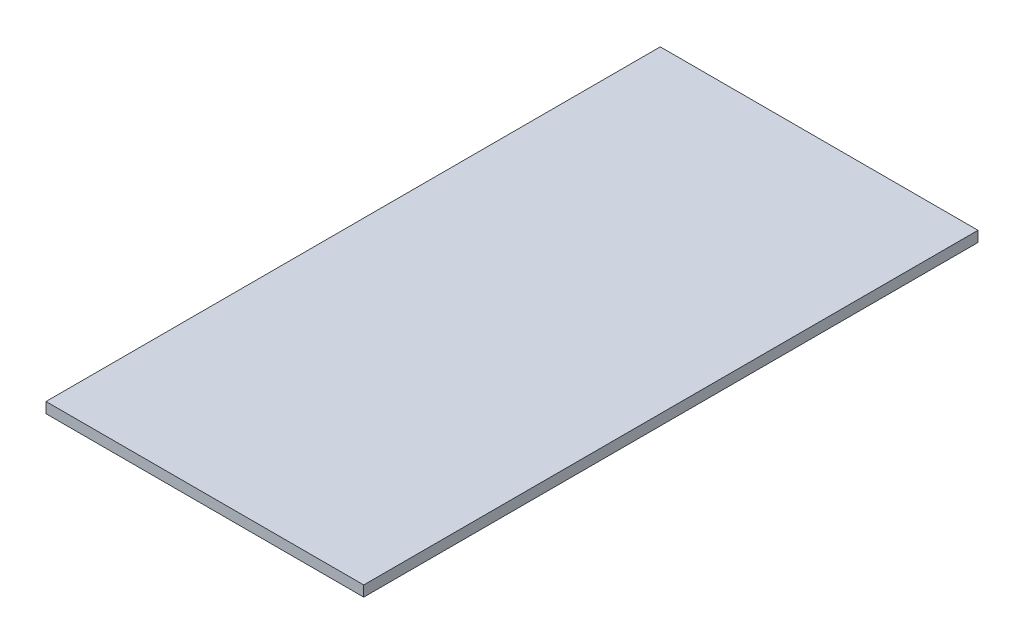
ISO-10303-21;
HEADER;
FILE_DESCRIPTION(('STEP AP214'),'2;1');
FILE_NAME('part.step','',(''),(''),'','','');
FILE_SCHEMA(('AUTOMOTIVE_DESIGN { 1 0 10303 214 1 1 1 1 }'));
ENDSEC;
DATA;
#1=APPLICATION_CONTEXT('core data for automotive mechanical design processes');
#2=APPLICATION_PROTOCOL_DEFINITION('international standard','automotive_design',2000,#1);
#3=PRODUCT_CONTEXT('',#1,'mechanical');
#4=PRODUCT('Part','Part','',(#3));
#5=PRODUCT_RELATED_PRODUCT_CATEGORY('part','',(#4));
#6=PRODUCT_DEFINITION_FORMATION('','',#4);
#7=PRODUCT_DEFINITION_CONTEXT('part definition',#1,'design');
#8=PRODUCT_DEFINITION('design','',#6,#7);
#9=PRODUCT_DEFINITION_SHAPE('','',#8);
#10=(LENGTH_UNIT() NAMED_UNIT(*) SI_UNIT(.MILLI.,.METRE.));
#11=(NAMED_UNIT(*) PLANE_ANGLE_UNIT() SI_UNIT($,.RADIAN.));
#12=(NAMED_UNIT(*) SI_UNIT($,.STERADIAN.) SOLID_ANGLE_UNIT());
#13=UNCERTAINTY_MEASURE_WITH_UNIT(LENGTH_MEASURE(1.E-05),#10,'distance_accuracy_value','');
#14=(GEOMETRIC_REPRESENTATION_CONTEXT(3) GLOBAL_UNCERTAINTY_ASSIGNED_CONTEXT((#13)) GLOBAL_UNIT_ASSIGNED_CONTEXT((#10,
#11,#12)) REPRESENTATION_CONTEXT('',''));
#15=CARTESIAN_POINT('',(0.,0.,0.));
#16=DIRECTION('',(0.,0.,1.));
#17=DIRECTION('',(1.,0.,0.));
#18=AXIS2_PLACEMENT_3D('',#15,#16,#17);
#19=CARTESIAN_POINT('',(0.,1.,0.));
#20=DIRECTION('',(1.,0.,0.));
#21=DIRECTION('',(0.,0.,-1.));
#22=AXIS2_PLACEMENT_3D('',#19,#20,#21);
#23=PLANE('',#22);
#24=DIRECTION('',(0.,0.,1.));
#25=VECTOR('',#24,1.);
#26=CARTESIAN_POINT('',(0.,0.,0.));
#27=LINE('',#26,#25);
#28=CARTESIAN_POINT('',(0.,0.,-58.));
#29=VERTEX_POINT('',#28);
#30=CARTESIAN_POINT('',(0.,0.,0.));
#31=VERTEX_POINT('',#30);
#32=EDGE_CURVE('E111',#29,#31,#27,.T.);
#33=ORIENTED_EDGE('',*,*,#32,.T.);
#34=DIRECTION('',(0.,-1.,0.));
#35=VECTOR('',#34,1.);
#36=CARTESIAN_POINT('',(0.,1.,0.));
#37=LINE('',#36,#35);
#38=CARTESIAN_POINT('',(0.,1.,0.));
#39=VERTEX_POINT('',#38);
#40=EDGE_CURVE('E11',#39,#31,#37,.T.);
#41=ORIENTED_EDGE('',*,*,#40,.F.);
#42=DIRECTION('',(0.,0.,1.));
#43=VECTOR('',#42,1.);
#44=CARTESIAN_POINT('',(0.,1.,0.));
#45=LINE('',#44,#43);
#46=CARTESIAN_POINT('',(0.,1.,-58.));
#47=VERTEX_POINT('',#46);
#48=EDGE_CURVE('E95',#47,#39,#45,.T.);
#49=ORIENTED_EDGE('',*,*,#48,.F.);
#50=DIRECTION('',(0.,-1.,0.));
#51=VECTOR('',#50,1.);
#52=CARTESIAN_POINT('',(0.,1.,-58.));
#53=LINE('',#52,#51);
#54=EDGE_CURVE('E107',#47,#29,#53,.T.);
#55=ORIENTED_EDGE('',*,*,#54,.T.);
#56=EDGE_LOOP('',(#33,#41,#49,#55));
#57=FACE_BOUND('',#56,.T.);
#58=ADVANCED_FACE('F43',(#57),#23,.F.);
#59=CARTESIAN_POINT('',(0.,1.,0.));
#60=DIRECTION('',(0.,0.,-1.));
#61=DIRECTION('',(-1.,0.,0.));
#62=AXIS2_PLACEMENT_3D('',#59,#60,#61);
#63=PLANE('',#62);
#64=DIRECTION('',(1.,0.,0.));
#65=VECTOR('',#64,1.);
#66=CARTESIAN_POINT('',(0.,0.,0.));
#67=LINE('',#66,#65);
#68=CARTESIAN_POINT('',(30.,0.,0.));
#69=VERTEX_POINT('',#68);
#70=EDGE_CURVE('E100',#31,#69,#67,.T.);
#71=ORIENTED_EDGE('',*,*,#70,.T.);
#72=DIRECTION('',(0.,-1.,0.));
#73=VECTOR('',#72,1.);
#74=CARTESIAN_POINT('',(30.,1.,0.));
#75=LINE('',#74,#73);
#76=CARTESIAN_POINT('',(30.,1.,0.));
#77=VERTEX_POINT('',#76);
#78=EDGE_CURVE('E52',#77,#69,#75,.T.);
#79=ORIENTED_EDGE('',*,*,#78,.F.);
#80=DIRECTION('',(1.,0.,0.));
#81=VECTOR('',#80,1.);
#82=CARTESIAN_POINT('',(0.,1.,0.));
#83=LINE('',#82,#81);
#84=EDGE_CURVE('E90',#39,#77,#83,.T.);
#85=ORIENTED_EDGE('',*,*,#84,.F.);
#86=ORIENTED_EDGE('',*,*,#40,.T.);
#87=EDGE_LOOP('',(#71,#79,#85,#86));
#88=FACE_BOUND('',#87,.T.);
#89=ADVANCED_FACE('F99',(#88),#63,.F.);
#90=CARTESIAN_POINT('',(30.,1.,0.));
#91=DIRECTION('',(-1.,0.,0.));
#92=DIRECTION('',(0.,0.,1.));
#93=AXIS2_PLACEMENT_3D('',#90,#91,#92);
#94=PLANE('',#93);
#95=DIRECTION('',(0.,0.,-1.));
#96=VECTOR('',#95,1.);
#97=CARTESIAN_POINT('',(30.,0.,0.));
#98=LINE('',#97,#96);
#99=CARTESIAN_POINT('',(30.,0.,-58.));
#100=VERTEX_POINT('',#99);
#101=EDGE_CURVE('E77',#69,#100,#98,.T.);
#102=ORIENTED_EDGE('',*,*,#101,.T.);
#103=DIRECTION('',(0.,-1.,0.));
#104=VECTOR('',#103,1.);
#105=CARTESIAN_POINT('',(30.,1.,-58.));
#106=LINE('',#105,#104);
#107=CARTESIAN_POINT('',(30.,1.,-58.));
#108=VERTEX_POINT('',#107);
#109=EDGE_CURVE('E102',#108,#100,#106,.T.);
#110=ORIENTED_EDGE('',*,*,#109,.F.);
#111=DIRECTION('',(0.,0.,-1.));
#112=VECTOR('',#111,1.);
#113=CARTESIAN_POINT('',(30.,1.,0.));
#114=LINE('',#113,#112);
#115=EDGE_CURVE('E93',#77,#108,#114,.T.);
#116=ORIENTED_EDGE('',*,*,#115,.F.);
#117=ORIENTED_EDGE('',*,*,#78,.T.);
#118=EDGE_LOOP('',(#102,#110,#116,#117));
#119=FACE_BOUND('',#118,.T.);
#120=ADVANCED_FACE('F103',(#119),#94,.F.);
#121=CARTESIAN_POINT('',(0.,1.,-58.));
#122=DIRECTION('',(0.,0.,1.));
#123=DIRECTION('',(1.,0.,0.));
#124=AXIS2_PLACEMENT_3D('',#121,#122,#123);
#125=PLANE('',#124);
#126=DIRECTION('',(-1.,0.,0.));
#127=VECTOR('',#126,1.);
#128=CARTESIAN_POINT('',(0.,0.,-58.));
#129=LINE('',#128,#127);
#130=EDGE_CURVE('E83',#100,#29,#129,.T.);
#131=ORIENTED_EDGE('',*,*,#130,.T.);
#132=ORIENTED_EDGE('',*,*,#54,.F.);
#133=DIRECTION('',(-1.,0.,0.));
#134=VECTOR('',#133,1.);
#135=CARTESIAN_POINT('',(0.,1.,-58.));
#136=LINE('',#135,#134);
#137=EDGE_CURVE('E60',#108,#47,#136,.T.);
#138=ORIENTED_EDGE('',*,*,#137,.F.);
#139=ORIENTED_EDGE('',*,*,#109,.T.);
#140=EDGE_LOOP('',(#131,#132,#138,#139));
#141=FACE_BOUND('',#140,.T.);
#142=ADVANCED_FACE('F124',(#141),#125,.F.);
#143=CARTESIAN_POINT('',(0.,1.,0.));
#144=DIRECTION('',(0.,-1.,0.));
#145=DIRECTION('',(0.,0.,-1.));
#146=AXIS2_PLACEMENT_3D('',#143,#144,#145);
#147=PLANE('',#146);
#148=ORIENTED_EDGE('',*,*,#48,.T.);
#149=ORIENTED_EDGE('',*,*,#84,.T.);
#150=ORIENTED_EDGE('',*,*,#115,.T.);
#151=ORIENTED_EDGE('',*,*,#137,.T.);
#152=EDGE_LOOP('',(#148,#149,#150,#151));
#153=FACE_BOUND('',#152,.T.);
#154=ADVANCED_FACE('F91',(#153),#147,.F.);
#155=CARTESIAN_POINT('',(0.,0.,0.));
#156=DIRECTION('',(0.,-1.,0.));
#157=DIRECTION('',(0.,0.,-1.));
#158=AXIS2_PLACEMENT_3D('',#155,#156,#157);
#159=PLANE('',#158);
#160=ORIENTED_EDGE('',*,*,#32,.F.);
#161=ORIENTED_EDGE('',*,*,#130,.F.);
#162=ORIENTED_EDGE('',*,*,#101,.F.);
#163=ORIENTED_EDGE('',*,*,#70,.F.);
#164=EDGE_LOOP('',(#160,#161,#162,#163));
#165=FACE_BOUND('',#164,.T.);
#166=ADVANCED_FACE('F127',(#165),#159,.T.);
#167=CLOSED_SHELL('',(#58,#89,#120,#142,#154,#166));
#168=MANIFOLD_SOLID_BREP('B2',#167);
#169=ADVANCED_BREP_SHAPE_REPRESENTATION('',(#18,#168),#14);
#170=SHAPE_DEFINITION_REPRESENTATION(#9,#169);
ENDSEC;
END-ISO-10303-21;
